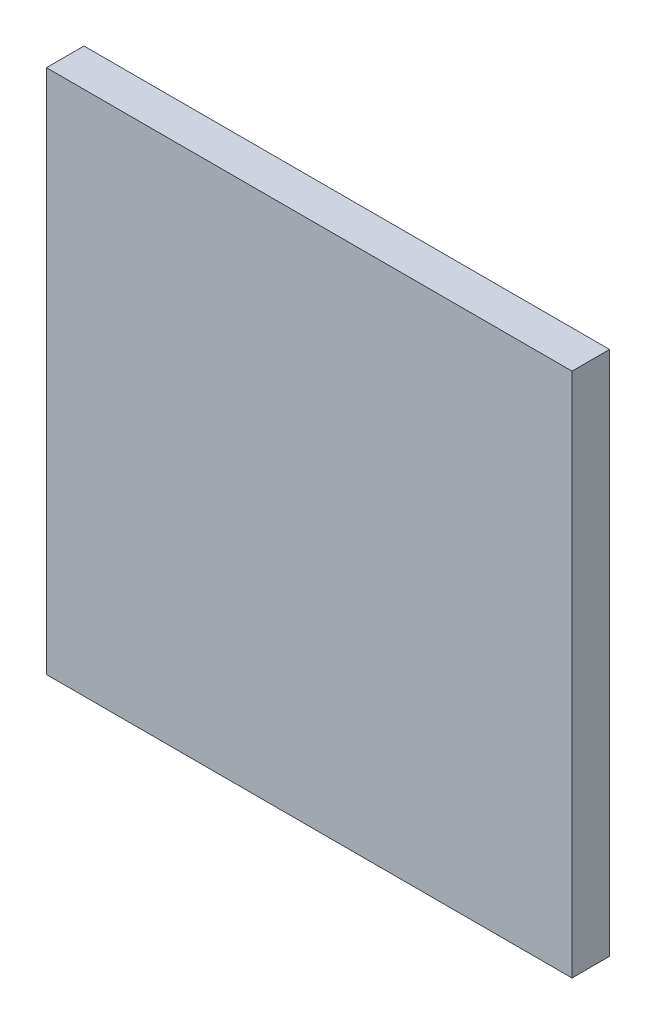
ISO-10303-21;
HEADER;
FILE_DESCRIPTION(('STEP AP214'),'2;1');
FILE_NAME('part.step','',(''),(''),'','','');
FILE_SCHEMA(('AUTOMOTIVE_DESIGN { 1 0 10303 214 1 1 1 1 }'));
ENDSEC;
DATA;
#1=APPLICATION_CONTEXT('core data for automotive mechanical design processes');
#2=APPLICATION_PROTOCOL_DEFINITION('international standard','automotive_design',2000,#1);
#3=PRODUCT_CONTEXT('',#1,'mechanical');
#4=PRODUCT('Part','Part','',(#3));
#5=PRODUCT_RELATED_PRODUCT_CATEGORY('part','',(#4));
#6=PRODUCT_DEFINITION_FORMATION('','',#4);
#7=PRODUCT_DEFINITION_CONTEXT('part definition',#1,'design');
#8=PRODUCT_DEFINITION('design','',#6,#7);
#9=PRODUCT_DEFINITION_SHAPE('','',#8);
#10=(LENGTH_UNIT() NAMED_UNIT(*) SI_UNIT(.MILLI.,.METRE.));
#11=(NAMED_UNIT(*) PLANE_ANGLE_UNIT() SI_UNIT($,.RADIAN.));
#12=(NAMED_UNIT(*) SI_UNIT($,.STERADIAN.) SOLID_ANGLE_UNIT());
#13=UNCERTAINTY_MEASURE_WITH_UNIT(LENGTH_MEASURE(1.E-05),#10,'distance_accuracy_value','');
#14=(GEOMETRIC_REPRESENTATION_CONTEXT(3) GLOBAL_UNCERTAINTY_ASSIGNED_CONTEXT((#13)) GLOBAL_UNIT_ASSIGNED_CONTEXT((#10,
#11,#12)) REPRESENTATION_CONTEXT('',''));
#15=CARTESIAN_POINT('',(0.,0.,0.));
#16=DIRECTION('',(0.,0.,1.));
#17=DIRECTION('',(1.,0.,0.));
#18=AXIS2_PLACEMENT_3D('',#15,#16,#17);
#19=CARTESIAN_POINT('',(70.,-70.,10.));
#20=DIRECTION('',(-1.,0.,0.));
#21=DIRECTION('',(0.,0.,1.));
#22=AXIS2_PLACEMENT_3D('',#19,#20,#21);
#23=PLANE('',#22);
#24=DIRECTION('',(0.,1.,0.));
#25=VECTOR('',#24,1.);
#26=CARTESIAN_POINT('',(70.,-70.,0.));
#27=LINE('',#26,#25);
#28=CARTESIAN_POINT('',(70.,-70.,0.));
#29=VERTEX_POINT('',#28);
#30=CARTESIAN_POINT('',(70.,70.,0.));
#31=VERTEX_POINT('',#30);
#32=EDGE_CURVE('E100',#29,#31,#27,.T.);
#33=ORIENTED_EDGE('',*,*,#32,.T.);
#34=DIRECTION('',(0.,0.,-1.));
#35=VECTOR('',#34,1.);
#36=CARTESIAN_POINT('',(70.,70.,10.));
#37=LINE('',#36,#35);
#38=CARTESIAN_POINT('',(70.,70.,10.));
#39=VERTEX_POINT('',#38);
#40=EDGE_CURVE('E91',#39,#31,#37,.T.);
#41=ORIENTED_EDGE('',*,*,#40,.F.);
#42=DIRECTION('',(0.,1.,0.));
#43=VECTOR('',#42,1.);
#44=CARTESIAN_POINT('',(70.,-70.,10.));
#45=LINE('',#44,#43);
#46=CARTESIAN_POINT('',(70.,-70.,10.));
#47=VERTEX_POINT('',#46);
#48=EDGE_CURVE('E85',#47,#39,#45,.T.);
#49=ORIENTED_EDGE('',*,*,#48,.F.);
#50=DIRECTION('',(0.,0.,-1.));
#51=VECTOR('',#50,1.);
#52=CARTESIAN_POINT('',(70.,-70.,10.));
#53=LINE('',#52,#51);
#54=EDGE_CURVE('E96',#47,#29,#53,.T.);
#55=ORIENTED_EDGE('',*,*,#54,.T.);
#56=EDGE_LOOP('',(#33,#41,#49,#55));
#57=FACE_BOUND('',#56,.T.);
#58=ADVANCED_FACE('F33',(#57),#23,.F.);
#59=CARTESIAN_POINT('',(-70.,70.,10.));
#60=DIRECTION('',(0.,-1.,0.));
#61=DIRECTION('',(0.,0.,-1.));
#62=AXIS2_PLACEMENT_3D('',#59,#60,#61);
#63=PLANE('',#62);
#64=DIRECTION('',(-1.,0.,0.));
#65=VECTOR('',#64,1.);
#66=CARTESIAN_POINT('',(-70.,70.,0.));
#67=LINE('',#66,#65);
#68=CARTESIAN_POINT('',(-70.,70.,0.));
#69=VERTEX_POINT('',#68);
#70=EDGE_CURVE('E90',#31,#69,#67,.T.);
#71=ORIENTED_EDGE('',*,*,#70,.T.);
#72=DIRECTION('',(0.,0.,-1.));
#73=VECTOR('',#72,1.);
#74=CARTESIAN_POINT('',(-70.,70.,10.));
#75=LINE('',#74,#73);
#76=CARTESIAN_POINT('',(-70.,70.,10.));
#77=VERTEX_POINT('',#76);
#78=EDGE_CURVE('E88',#77,#69,#75,.T.);
#79=ORIENTED_EDGE('',*,*,#78,.F.);
#80=DIRECTION('',(-1.,0.,0.));
#81=VECTOR('',#80,1.);
#82=CARTESIAN_POINT('',(-70.,70.,10.));
#83=LINE('',#82,#81);
#84=EDGE_CURVE('E80',#39,#77,#83,.T.);
#85=ORIENTED_EDGE('',*,*,#84,.F.);
#86=ORIENTED_EDGE('',*,*,#40,.T.);
#87=EDGE_LOOP('',(#71,#79,#85,#86));
#88=FACE_BOUND('',#87,.T.);
#89=ADVANCED_FACE('F89',(#88),#63,.F.);
#90=CARTESIAN_POINT('',(-70.,-70.,10.));
#91=DIRECTION('',(1.,0.,0.));
#92=DIRECTION('',(0.,0.,-1.));
#93=AXIS2_PLACEMENT_3D('',#90,#91,#92);
#94=PLANE('',#93);
#95=DIRECTION('',(0.,-1.,0.));
#96=VECTOR('',#95,1.);
#97=CARTESIAN_POINT('',(-70.,-70.,0.));
#98=LINE('',#97,#96);
#99=CARTESIAN_POINT('',(-70.,-70.,0.));
#100=VERTEX_POINT('',#99);
#101=EDGE_CURVE('E66',#69,#100,#98,.T.);
#102=ORIENTED_EDGE('',*,*,#101,.T.);
#103=DIRECTION('',(0.,0.,-1.));
#104=VECTOR('',#103,1.);
#105=CARTESIAN_POINT('',(-70.,-70.,10.));
#106=LINE('',#105,#104);
#107=CARTESIAN_POINT('',(-70.,-70.,10.));
#108=VERTEX_POINT('',#107);
#109=EDGE_CURVE('E92',#108,#100,#106,.T.);
#110=ORIENTED_EDGE('',*,*,#109,.F.);
#111=DIRECTION('',(0.,-1.,0.));
#112=VECTOR('',#111,1.);
#113=CARTESIAN_POINT('',(-70.,-70.,10.));
#114=LINE('',#113,#112);
#115=EDGE_CURVE('E83',#77,#108,#114,.T.);
#116=ORIENTED_EDGE('',*,*,#115,.F.);
#117=ORIENTED_EDGE('',*,*,#78,.T.);
#118=EDGE_LOOP('',(#102,#110,#116,#117));
#119=FACE_BOUND('',#118,.T.);
#120=ADVANCED_FACE('F94',(#119),#94,.F.);
#121=CARTESIAN_POINT('',(-70.,-70.,10.));
#122=DIRECTION('',(0.,1.,0.));
#123=DIRECTION('',(0.,0.,1.));
#124=AXIS2_PLACEMENT_3D('',#121,#122,#123);
#125=PLANE('',#124);
#126=DIRECTION('',(1.,0.,0.));
#127=VECTOR('',#126,1.);
#128=CARTESIAN_POINT('',(-70.,-70.,0.));
#129=LINE('',#128,#127);
#130=EDGE_CURVE('E72',#100,#29,#129,.T.);
#131=ORIENTED_EDGE('',*,*,#130,.T.);
#132=ORIENTED_EDGE('',*,*,#54,.F.);
#133=DIRECTION('',(1.,0.,0.));
#134=VECTOR('',#133,1.);
#135=CARTESIAN_POINT('',(-70.,-70.,10.));
#136=LINE('',#135,#134);
#137=EDGE_CURVE('E49',#108,#47,#136,.T.);
#138=ORIENTED_EDGE('',*,*,#137,.F.);
#139=ORIENTED_EDGE('',*,*,#109,.T.);
#140=EDGE_LOOP('',(#131,#132,#138,#139));
#141=FACE_BOUND('',#140,.T.);
#142=ADVANCED_FACE('F121',(#141),#125,.F.);
#143=CARTESIAN_POINT('',(0.,0.,10.));
#144=DIRECTION('',(0.,0.,-1.));
#145=DIRECTION('',(-1.,0.,0.));
#146=AXIS2_PLACEMENT_3D('',#143,#144,#145);
#147=PLANE('',#146);
#148=ORIENTED_EDGE('',*,*,#48,.T.);
#149=ORIENTED_EDGE('',*,*,#84,.T.);
#150=ORIENTED_EDGE('',*,*,#115,.T.);
#151=ORIENTED_EDGE('',*,*,#137,.T.);
#152=EDGE_LOOP('',(#148,#149,#150,#151));
#153=FACE_BOUND('',#152,.T.);
#154=ADVANCED_FACE('F81',(#153),#147,.F.);
#155=CARTESIAN_POINT('',(0.,0.,0.));
#156=DIRECTION('',(0.,0.,-1.));
#157=DIRECTION('',(-1.,0.,0.));
#158=AXIS2_PLACEMENT_3D('',#155,#156,#157);
#159=PLANE('',#158);
#160=CARTESIAN_POINT('',(31.9,0.,0.));
#161=DIRECTION('',(0.,0.,-1.));
#162=DIRECTION('',(-1.,0.,0.));
#163=AXIS2_PLACEMENT_3D('',#160,#161,#162);
#164=CIRCLE('',#163,5.);
#165=CARTESIAN_POINT('',(26.9,0.,0.));
#166=VERTEX_POINT('',#165);
#167=EDGE_CURVE('E11',#166,#166,#164,.T.);
#168=ORIENTED_EDGE('',*,*,#167,.F.);
#169=EDGE_LOOP('',(#168));
#170=FACE_BOUND('',#169,.T.);
#171=CARTESIAN_POINT('',(-31.9,0.,0.));
#172=DIRECTION('',(0.,0.,-1.));
#173=DIRECTION('',(-1.,0.,0.));
#174=AXIS2_PLACEMENT_3D('',#171,#172,#173);
#175=CIRCLE('',#174,5.);
#176=CARTESIAN_POINT('',(-36.9,0.,0.));
#177=VERTEX_POINT('',#176);
#178=EDGE_CURVE('E41',#177,#177,#175,.T.);
#179=ORIENTED_EDGE('',*,*,#178,.F.);
#180=EDGE_LOOP('',(#179));
#181=FACE_BOUND('',#180,.T.);
#182=ORIENTED_EDGE('',*,*,#32,.F.);
#183=ORIENTED_EDGE('',*,*,#130,.F.);
#184=ORIENTED_EDGE('',*,*,#101,.F.);
#185=ORIENTED_EDGE('',*,*,#70,.F.);
#186=EDGE_LOOP('',(#182,#183,#184,#185));
#187=FACE_BOUND('',#186,.T.);
#188=ADVANCED_FACE('F114',(#170,#181,#187),#159,.T.);
#189=CARTESIAN_POINT('',(-31.9,0.,-30.));
#190=DIRECTION('',(0.,0.,1.));
#191=DIRECTION('',(1.,0.,0.));
#192=AXIS2_PLACEMENT_3D('',#189,#190,#191);
#193=CYLINDRICAL_SURFACE('',#192,5.);
#194=CARTESIAN_POINT('',(-31.9,0.,-30.));
#195=DIRECTION('',(0.,0.,1.));
#196=DIRECTION('',(1.,0.,0.));
#197=AXIS2_PLACEMENT_3D('',#194,#195,#196);
#198=CIRCLE('',#197,5.);
#199=CARTESIAN_POINT('',(-26.9,0.,-30.));
#200=VERTEX_POINT('',#199);
#201=EDGE_CURVE('E103',#200,#200,#198,.T.);
#202=ORIENTED_EDGE('',*,*,#201,.T.);
#203=EDGE_LOOP('',(#202));
#204=FACE_BOUND('',#203,.T.);
#205=ORIENTED_EDGE('',*,*,#178,.T.);
#206=EDGE_LOOP('',(#205));
#207=FACE_BOUND('',#206,.T.);
#208=ADVANCED_FACE('F112',(#204,#207),#193,.T.);
#209=CARTESIAN_POINT('',(-31.9,0.,-30.));
#210=DIRECTION('',(0.,0.,1.));
#211=DIRECTION('',(1.,0.,0.));
#212=AXIS2_PLACEMENT_3D('',#209,#210,#211);
#213=PLANE('',#212);
#214=ORIENTED_EDGE('',*,*,#201,.F.);
#215=EDGE_LOOP('',(#214));
#216=FACE_BOUND('',#215,.T.);
#217=ADVANCED_FACE('F165',(#216),#213,.F.);
#218=CARTESIAN_POINT('',(31.9,0.,-30.));
#219=DIRECTION('',(0.,0.,1.));
#220=DIRECTION('',(1.,0.,0.));
#221=AXIS2_PLACEMENT_3D('',#218,#219,#220);
#222=CYLINDRICAL_SURFACE('',#221,5.);
#223=CARTESIAN_POINT('',(31.9,0.,-30.));
#224=DIRECTION('',(0.,0.,1.));
#225=DIRECTION('',(1.,0.,0.));
#226=AXIS2_PLACEMENT_3D('',#223,#224,#225);
#227=CIRCLE('',#226,5.);
#228=CARTESIAN_POINT('',(36.9,0.,-30.));
#229=VERTEX_POINT('',#228);
#230=EDGE_CURVE('E201',#229,#229,#227,.T.);
#231=ORIENTED_EDGE('',*,*,#230,.T.);
#232=EDGE_LOOP('',(#231));
#233=FACE_BOUND('',#232,.T.);
#234=ORIENTED_EDGE('',*,*,#167,.T.);
#235=EDGE_LOOP('',(#234));
#236=FACE_BOUND('',#235,.T.);
#237=ADVANCED_FACE('F175',(#233,#236),#222,.T.);
#238=CARTESIAN_POINT('',(31.9,0.,-30.));
#239=DIRECTION('',(0.,0.,1.));
#240=DIRECTION('',(1.,0.,0.));
#241=AXIS2_PLACEMENT_3D('',#238,#239,#240);
#242=PLANE('',#241);
#243=ORIENTED_EDGE('',*,*,#230,.F.);
#244=EDGE_LOOP('',(#243));
#245=FACE_BOUND('',#244,.T.);
#246=ADVANCED_FACE('F185',(#245),#242,.F.);
#247=CLOSED_SHELL('',(#58,#89,#120,#142,#154,#188,#208,#217,#237,#246));
#248=MANIFOLD_SOLID_BREP('B2',#247);
#249=ADVANCED_BREP_SHAPE_REPRESENTATION('',(#18,#248),#14);
#250=SHAPE_DEFINITION_REPRESENTATION(#9,#249);
ENDSEC;
END-ISO-10303-21;
